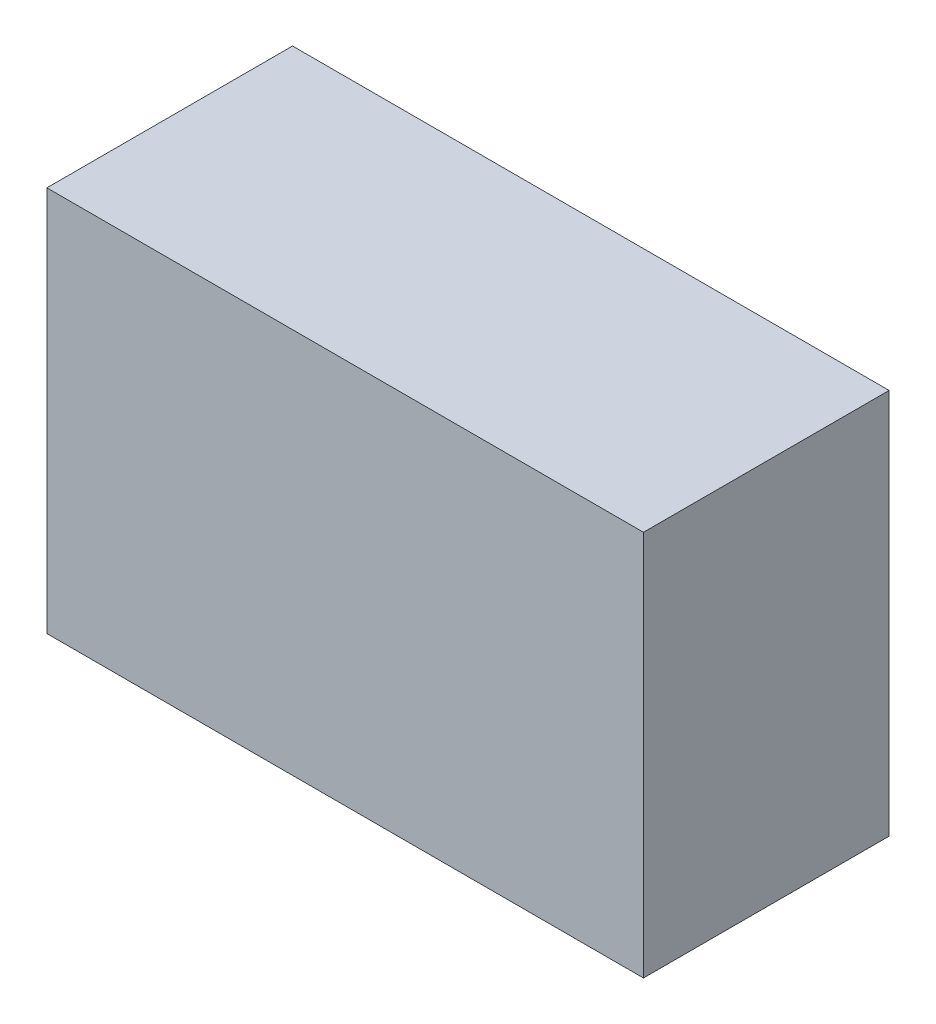
ISO-10303-21;
HEADER;
FILE_DESCRIPTION(('STEP AP214'),'2;1');
FILE_NAME('part.step','',(''),(''),'','','');
FILE_SCHEMA(('AUTOMOTIVE_DESIGN { 1 0 10303 214 1 1 1 1 }'));
ENDSEC;
DATA;
#1=APPLICATION_CONTEXT('core data for automotive mechanical design processes');
#2=APPLICATION_PROTOCOL_DEFINITION('international standard','automotive_design',2000,#1);
#3=PRODUCT_CONTEXT('',#1,'mechanical');
#4=PRODUCT('Part','Part','',(#3));
#5=PRODUCT_RELATED_PRODUCT_CATEGORY('part','',(#4));
#6=PRODUCT_DEFINITION_FORMATION('','',#4);
#7=PRODUCT_DEFINITION_CONTEXT('part definition',#1,'design');
#8=PRODUCT_DEFINITION('design','',#6,#7);
#9=PRODUCT_DEFINITION_SHAPE('','',#8);
#10=(LENGTH_UNIT() NAMED_UNIT(*) SI_UNIT(.MILLI.,.METRE.));
#11=(NAMED_UNIT(*) PLANE_ANGLE_UNIT() SI_UNIT($,.RADIAN.));
#12=(NAMED_UNIT(*) SI_UNIT($,.STERADIAN.) SOLID_ANGLE_UNIT());
#13=UNCERTAINTY_MEASURE_WITH_UNIT(LENGTH_MEASURE(1.E-05),#10,'distance_accuracy_value','');
#14=(GEOMETRIC_REPRESENTATION_CONTEXT(3) GLOBAL_UNCERTAINTY_ASSIGNED_CONTEXT((#13)) GLOBAL_UNIT_ASSIGNED_CONTEXT((#10,
#11,#12)) REPRESENTATION_CONTEXT('',''));
#15=CARTESIAN_POINT('',(0.,0.,0.));
#16=DIRECTION('',(0.,0.,1.));
#17=DIRECTION('',(1.,0.,0.));
#18=AXIS2_PLACEMENT_3D('',#15,#16,#17);
#19=CARTESIAN_POINT('',(-0.0508,-1.397,2.032));
#20=DIRECTION('',(0.,0.,1.));
#21=DIRECTION('',(1.,0.,0.));
#22=AXIS2_PLACEMENT_3D('',#19,#20,#21);
#23=PLANE('',#22);
#24=DIRECTION('',(0.,1.,0.));
#25=VECTOR('',#24,1.);
#26=CARTESIAN_POINT('',(4.2672,-1.397,2.032));
#27=LINE('',#26,#25);
#28=CARTESIAN_POINT('',(4.2672,1.397,2.032));
#29=VERTEX_POINT('',#28);
#30=CARTESIAN_POINT('',(4.2672,-1.397,2.032));
#31=VERTEX_POINT('',#30);
#32=EDGE_CURVE('E76',#29,#31,#27,.F.);
#33=ORIENTED_EDGE('',*,*,#32,.F.);
#34=DIRECTION('',(1.,0.,0.));
#35=VECTOR('',#34,1.);
#36=CARTESIAN_POINT('',(-0.0508,1.397,2.032));
#37=LINE('',#36,#35);
#38=CARTESIAN_POINT('',(-0.0508,1.397,2.032));
#39=VERTEX_POINT('',#38);
#40=EDGE_CURVE('E58',#39,#29,#37,.T.);
#41=ORIENTED_EDGE('',*,*,#40,.F.);
#42=DIRECTION('',(0.,1.,0.));
#43=VECTOR('',#42,1.);
#44=CARTESIAN_POINT('',(-0.0508,-1.397,2.032));
#45=LINE('',#44,#43);
#46=CARTESIAN_POINT('',(-0.0508,-1.397,2.032));
#47=VERTEX_POINT('',#46);
#48=EDGE_CURVE('E20',#39,#47,#45,.F.);
#49=ORIENTED_EDGE('',*,*,#48,.T.);
#50=DIRECTION('',(1.,0.,0.));
#51=VECTOR('',#50,1.);
#52=CARTESIAN_POINT('',(-0.0508,-1.397,2.032));
#53=LINE('',#52,#51);
#54=EDGE_CURVE('E55',#47,#31,#53,.T.);
#55=ORIENTED_EDGE('',*,*,#54,.T.);
#56=EDGE_LOOP('',(#33,#41,#49,#55));
#57=FACE_BOUND('',#56,.T.);
#58=ADVANCED_FACE('F17',(#57),#23,.T.);
#59=CARTESIAN_POINT('',(-0.0508,-1.397,0.254));
#60=DIRECTION('',(1.,0.,0.));
#61=DIRECTION('',(0.,0.,-1.));
#62=AXIS2_PLACEMENT_3D('',#59,#60,#61);
#63=PLANE('',#62);
#64=DIRECTION('',(0.,0.,1.));
#65=VECTOR('',#64,1.);
#66=CARTESIAN_POINT('',(-0.0508,1.397,0.254));
#67=LINE('',#66,#65);
#68=CARTESIAN_POINT('',(-0.0508,1.397,0.254));
#69=VERTEX_POINT('',#68);
#70=EDGE_CURVE('E78',#69,#39,#67,.T.);
#71=ORIENTED_EDGE('',*,*,#70,.F.);
#72=DIRECTION('',(0.,1.,0.));
#73=VECTOR('',#72,1.);
#74=CARTESIAN_POINT('',(-0.0508,-1.397,0.254));
#75=LINE('',#74,#73);
#76=CARTESIAN_POINT('',(-0.0508,-1.397,0.254));
#77=VERTEX_POINT('',#76);
#78=EDGE_CURVE('E73',#69,#77,#75,.F.);
#79=ORIENTED_EDGE('',*,*,#78,.T.);
#80=DIRECTION('',(0.,0.,1.));
#81=VECTOR('',#80,1.);
#82=CARTESIAN_POINT('',(-0.0508,-1.397,0.254));
#83=LINE('',#82,#81);
#84=EDGE_CURVE('E63',#77,#47,#83,.T.);
#85=ORIENTED_EDGE('',*,*,#84,.T.);
#86=ORIENTED_EDGE('',*,*,#48,.F.);
#87=EDGE_LOOP('',(#71,#79,#85,#86));
#88=FACE_BOUND('',#87,.T.);
#89=ADVANCED_FACE('F72',(#88),#63,.F.);
#90=CARTESIAN_POINT('',(-0.0508,-1.397,0.254));
#91=DIRECTION('',(0.,1.,0.));
#92=DIRECTION('',(0.,0.,1.));
#93=AXIS2_PLACEMENT_3D('',#90,#91,#92);
#94=PLANE('',#93);
#95=ORIENTED_EDGE('',*,*,#54,.F.);
#96=ORIENTED_EDGE('',*,*,#84,.F.);
#97=DIRECTION('',(1.,0.,0.));
#98=VECTOR('',#97,1.);
#99=CARTESIAN_POINT('',(-0.0508,-1.397,0.254));
#100=LINE('',#99,#98);
#101=CARTESIAN_POINT('',(4.2672,-1.397,0.254));
#102=VERTEX_POINT('',#101);
#103=EDGE_CURVE('E83',#77,#102,#100,.T.);
#104=ORIENTED_EDGE('',*,*,#103,.T.);
#105=DIRECTION('',(0.,0.,-1.));
#106=VECTOR('',#105,1.);
#107=CARTESIAN_POINT('',(4.2672,-1.397,0.254));
#108=LINE('',#107,#106);
#109=EDGE_CURVE('E69',#31,#102,#108,.T.);
#110=ORIENTED_EDGE('',*,*,#109,.F.);
#111=EDGE_LOOP('',(#95,#96,#104,#110));
#112=FACE_BOUND('',#111,.T.);
#113=ADVANCED_FACE('F66',(#112),#94,.F.);
#114=CARTESIAN_POINT('',(4.2672,-1.397,0.254));
#115=DIRECTION('',(1.,0.,0.));
#116=DIRECTION('',(0.,0.,-1.));
#117=AXIS2_PLACEMENT_3D('',#114,#115,#116);
#118=PLANE('',#117);
#119=DIRECTION('',(0.,0.,1.));
#120=VECTOR('',#119,1.);
#121=CARTESIAN_POINT('',(4.2672,1.397,0.254));
#122=LINE('',#121,#120);
#123=CARTESIAN_POINT('',(4.2672,1.397,0.254));
#124=VERTEX_POINT('',#123);
#125=EDGE_CURVE('E34',#29,#124,#122,.F.);
#126=ORIENTED_EDGE('',*,*,#125,.F.);
#127=ORIENTED_EDGE('',*,*,#32,.T.);
#128=ORIENTED_EDGE('',*,*,#109,.T.);
#129=DIRECTION('',(0.,1.,0.));
#130=VECTOR('',#129,1.);
#131=CARTESIAN_POINT('',(4.2672,-1.397,0.254));
#132=LINE('',#131,#130);
#133=EDGE_CURVE('E26',#102,#124,#132,.T.);
#134=ORIENTED_EDGE('',*,*,#133,.T.);
#135=EDGE_LOOP('',(#126,#127,#128,#134));
#136=FACE_BOUND('',#135,.T.);
#137=ADVANCED_FACE('F88',(#136),#118,.T.);
#138=CARTESIAN_POINT('',(-0.0508,1.397,0.254));
#139=DIRECTION('',(0.,1.,0.));
#140=DIRECTION('',(0.,0.,1.));
#141=AXIS2_PLACEMENT_3D('',#138,#139,#140);
#142=PLANE('',#141);
#143=ORIENTED_EDGE('',*,*,#40,.T.);
#144=ORIENTED_EDGE('',*,*,#125,.T.);
#145=DIRECTION('',(1.,0.,0.));
#146=VECTOR('',#145,1.);
#147=CARTESIAN_POINT('',(-0.0508,1.397,0.254));
#148=LINE('',#147,#146);
#149=EDGE_CURVE('E11',#124,#69,#148,.F.);
#150=ORIENTED_EDGE('',*,*,#149,.T.);
#151=ORIENTED_EDGE('',*,*,#70,.T.);
#152=EDGE_LOOP('',(#143,#144,#150,#151));
#153=FACE_BOUND('',#152,.T.);
#154=ADVANCED_FACE('F91',(#153),#142,.T.);
#155=CARTESIAN_POINT('',(-0.0508,-1.397,0.254));
#156=DIRECTION('',(0.,0.,1.));
#157=DIRECTION('',(1.,0.,0.));
#158=AXIS2_PLACEMENT_3D('',#155,#156,#157);
#159=PLANE('',#158);
#160=ORIENTED_EDGE('',*,*,#133,.F.);
#161=ORIENTED_EDGE('',*,*,#103,.F.);
#162=ORIENTED_EDGE('',*,*,#78,.F.);
#163=ORIENTED_EDGE('',*,*,#149,.F.);
#164=EDGE_LOOP('',(#160,#161,#162,#163));
#165=FACE_BOUND('',#164,.T.);
#166=ADVANCED_FACE('F90',(#165),#159,.F.);
#167=CLOSED_SHELL('',(#58,#89,#113,#137,#154,#166));
#168=MANIFOLD_SOLID_BREP('B1',#167);
#169=ADVANCED_BREP_SHAPE_REPRESENTATION('',(#18,#168),#14);
#170=SHAPE_DEFINITION_REPRESENTATION(#9,#169);
ENDSEC;
END-ISO-10303-21;
